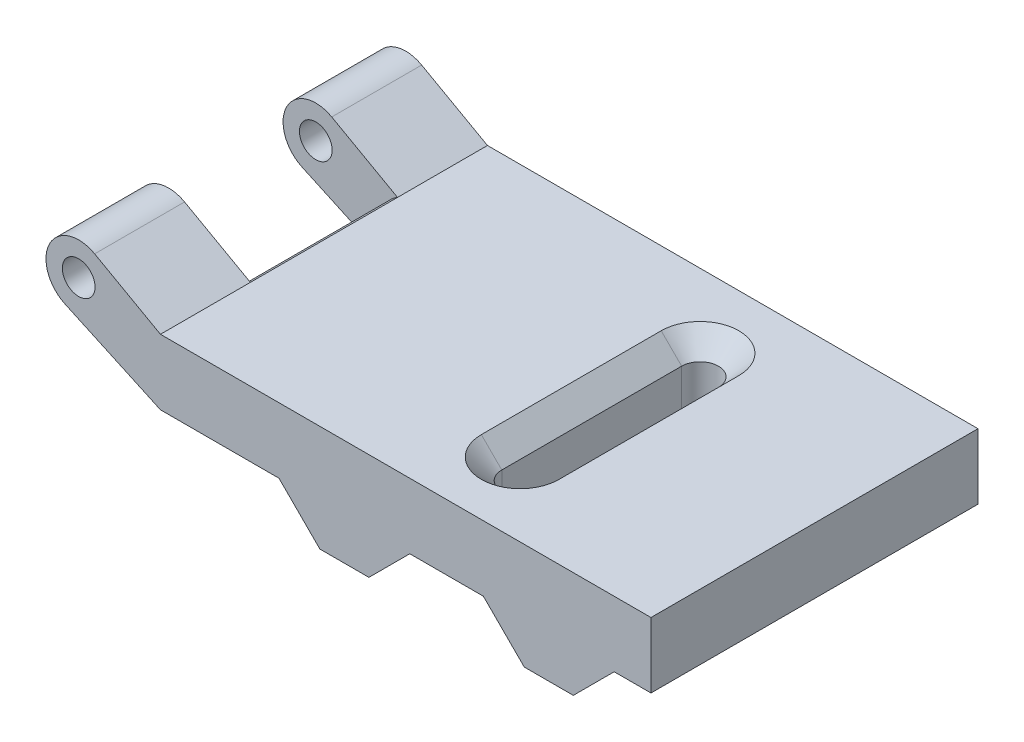
ISO-10303-21;
HEADER;
FILE_DESCRIPTION(('STEP AP214'),'2;1');
FILE_NAME('part.step','',(''),(''),'','','');
FILE_SCHEMA(('AUTOMOTIVE_DESIGN { 1 0 10303 214 1 1 1 1 }'));
ENDSEC;
DATA;
#1=APPLICATION_CONTEXT('core data for automotive mechanical design processes');
#2=APPLICATION_PROTOCOL_DEFINITION('international standard','automotive_design',2000,#1);
#3=PRODUCT_CONTEXT('',#1,'mechanical');
#4=PRODUCT('Part','Part','',(#3));
#5=PRODUCT_RELATED_PRODUCT_CATEGORY('part','',(#4));
#6=PRODUCT_DEFINITION_FORMATION('','',#4);
#7=PRODUCT_DEFINITION_CONTEXT('part definition',#1,'design');
#8=PRODUCT_DEFINITION('design','',#6,#7);
#9=PRODUCT_DEFINITION_SHAPE('','',#8);
#10=(LENGTH_UNIT() NAMED_UNIT(*) SI_UNIT(.MILLI.,.METRE.));
#11=(NAMED_UNIT(*) PLANE_ANGLE_UNIT() SI_UNIT($,.RADIAN.));
#12=(NAMED_UNIT(*) SI_UNIT($,.STERADIAN.) SOLID_ANGLE_UNIT());
#13=UNCERTAINTY_MEASURE_WITH_UNIT(LENGTH_MEASURE(1.E-05),#10,'distance_accuracy_value','');
#14=(GEOMETRIC_REPRESENTATION_CONTEXT(3) GLOBAL_UNCERTAINTY_ASSIGNED_CONTEXT((#13)) GLOBAL_UNIT_ASSIGNED_CONTEXT((#10,
#11,#12)) REPRESENTATION_CONTEXT('',''));
#15=CARTESIAN_POINT('',(0.,0.,0.));
#16=DIRECTION('',(0.,0.,1.));
#17=DIRECTION('',(1.,0.,0.));
#18=AXIS2_PLACEMENT_3D('',#15,#16,#17);
#19=CARTESIAN_POINT('',(-1.67087498802179,-3.63430554224644,40.));
#20=DIRECTION('',(0.417718747005448,0.908576385561609,0.));
#21=DIRECTION('',(-0.908576385561609,0.417718747005448,0.));
#22=AXIS2_PLACEMENT_3D('',#19,#20,#21);
#23=PLANE('',#22);
#24=DIRECTION('',(0.,0.,-1.));
#25=VECTOR('',#24,1.);
#26=CARTESIAN_POINT('',(10.,-9.,40.));
#27=LINE('',#26,#25);
#28=CARTESIAN_POINT('',(10.,-9.,11.));
#29=VERTEX_POINT('',#28);
#30=CARTESIAN_POINT('',(10.,-9.,0.));
#31=VERTEX_POINT('',#30);
#32=EDGE_CURVE('E305',#29,#31,#27,.T.);
#33=ORIENTED_EDGE('',*,*,#32,.F.);
#34=DIRECTION('',(-0.908576385561609,0.417718747005448,0.));
#35=VECTOR('',#34,1.);
#36=CARTESIAN_POINT('',(-1.67087498802178,-3.63430554224644,11.));
#37=LINE('',#36,#35);
#38=CARTESIAN_POINT('',(-1.67087498802179,-3.63430554224644,11.));
#39=VERTEX_POINT('',#38);
#40=EDGE_CURVE('E230',#29,#39,#37,.T.);
#41=ORIENTED_EDGE('',*,*,#40,.T.);
#42=DIRECTION('',(0.,0.,-1.));
#43=VECTOR('',#42,1.);
#44=CARTESIAN_POINT('',(-1.67087498802179,-3.63430554224644,40.));
#45=LINE('',#44,#43);
#46=CARTESIAN_POINT('',(-1.67087498802179,-3.63430554224644,0.));
#47=VERTEX_POINT('',#46);
#48=EDGE_CURVE('E227',#39,#47,#45,.T.);
#49=ORIENTED_EDGE('',*,*,#48,.T.);
#50=DIRECTION('',(0.908576385561609,-0.417718747005448,0.));
#51=VECTOR('',#50,1.);
#52=CARTESIAN_POINT('',(-1.67087498802179,-3.63430554224644,0.));
#53=LINE('',#52,#51);
#54=EDGE_CURVE('E501',#47,#31,#53,.T.);
#55=ORIENTED_EDGE('',*,*,#54,.T.);
#56=EDGE_LOOP('',(#33,#41,#49,#55));
#57=FACE_BOUND('',#56,.T.);
#58=ADVANCED_FACE('F41',(#57),#23,.F.);
#59=CARTESIAN_POINT('',(10.,-0.999999999999999,40.));
#60=DIRECTION('',(-0.487322222349435,-0.873222223494345,0.));
#61=DIRECTION('',(0.873222223494345,-0.487322222349435,0.));
#62=AXIS2_PLACEMENT_3D('',#59,#60,#61);
#63=PLANE('',#62);
#64=DIRECTION('',(0.,0.,-1.));
#65=VECTOR('',#64,1.);
#66=CARTESIAN_POINT('',(10.,-0.999999999999999,40.));
#67=LINE('',#66,#65);
#68=CARTESIAN_POINT('',(10.,-0.999999999999999,40.));
#69=VERTEX_POINT('',#68);
#70=CARTESIAN_POINT('',(10.,-0.999999999999999,29.));
#71=VERTEX_POINT('',#70);
#72=EDGE_CURVE('E260',#69,#71,#67,.T.);
#73=ORIENTED_EDGE('',*,*,#72,.T.);
#74=DIRECTION('',(-0.873222223494345,0.487322222349435,0.));
#75=VECTOR('',#74,1.);
#76=CARTESIAN_POINT('',(10.,-0.999999999999998,29.));
#77=LINE('',#76,#75);
#78=CARTESIAN_POINT('',(1.94928888939774,3.49288889397738,29.));
#79=VERTEX_POINT('',#78);
#80=EDGE_CURVE('E363',#71,#79,#77,.T.);
#81=ORIENTED_EDGE('',*,*,#80,.T.);
#82=DIRECTION('',(0.,0.,-1.));
#83=VECTOR('',#82,1.);
#84=CARTESIAN_POINT('',(1.94928888939774,3.49288889397738,40.));
#85=LINE('',#84,#83);
#86=CARTESIAN_POINT('',(1.94928888939774,3.49288889397738,40.));
#87=VERTEX_POINT('',#86);
#88=EDGE_CURVE('E248',#87,#79,#85,.T.);
#89=ORIENTED_EDGE('',*,*,#88,.F.);
#90=DIRECTION('',(-0.873222223494345,0.487322222349435,0.));
#91=VECTOR('',#90,1.);
#92=CARTESIAN_POINT('',(10.,-0.999999999999999,40.));
#93=LINE('',#92,#91);
#94=EDGE_CURVE('E249',#69,#87,#93,.T.);
#95=ORIENTED_EDGE('',*,*,#94,.F.);
#96=EDGE_LOOP('',(#73,#81,#89,#95));
#97=FACE_BOUND('',#96,.T.);
#98=ADVANCED_FACE('F563',(#97),#63,.F.);
#99=CARTESIAN_POINT('',(0.,0.,40.));
#100=DIRECTION('',(0.,0.,-1.));
#101=DIRECTION('',(-1.,0.,0.));
#102=AXIS2_PLACEMENT_3D('',#99,#100,#101);
#103=CYLINDRICAL_SURFACE('',#102,4.);
#104=ORIENTED_EDGE('',*,*,#88,.T.);
#105=CARTESIAN_POINT('',(0.,0.,29.));
#106=DIRECTION('',(0.,0.,1.));
#107=DIRECTION('',(1.,0.,0.));
#108=AXIS2_PLACEMENT_3D('',#105,#106,#107);
#109=CIRCLE('',#108,4.);
#110=CARTESIAN_POINT('',(-1.67087498802179,-3.63430554224644,29.));
#111=VERTEX_POINT('',#110);
#112=EDGE_CURVE('E422',#79,#111,#109,.T.);
#113=ORIENTED_EDGE('',*,*,#112,.T.);
#114=CARTESIAN_POINT('',(-1.67087498802179,-3.63430554224644,40.));
#115=VERTEX_POINT('',#114);
#116=EDGE_CURVE('E310',#115,#111,#45,.T.);
#117=ORIENTED_EDGE('',*,*,#116,.F.);
#118=CARTESIAN_POINT('',(0.,0.,40.));
#119=DIRECTION('',(0.,0.,1.));
#120=DIRECTION('',(1.,0.,0.));
#121=AXIS2_PLACEMENT_3D('',#118,#119,#120);
#122=CIRCLE('',#121,4.);
#123=EDGE_CURVE('E410',#87,#115,#122,.T.);
#124=ORIENTED_EDGE('',*,*,#123,.F.);
#125=EDGE_LOOP('',(#104,#113,#117,#124));
#126=FACE_BOUND('',#125,.T.);
#127=ADVANCED_FACE('F421',(#126),#103,.T.);
#128=CARTESIAN_POINT('',(0.,0.,40.));
#129=DIRECTION('',(0.,0.,-1.));
#130=DIRECTION('',(-1.,0.,0.));
#131=AXIS2_PLACEMENT_3D('',#128,#129,#130);
#132=CYLINDRICAL_SURFACE('',#131,2.);
#133=CARTESIAN_POINT('',(0.,0.,29.));
#134=DIRECTION('',(0.,0.,1.));
#135=DIRECTION('',(1.,0.,0.));
#136=AXIS2_PLACEMENT_3D('',#133,#134,#135);
#137=CIRCLE('',#136,2.);
#138=CARTESIAN_POINT('',(2.,0.,29.));
#139=VERTEX_POINT('',#138);
#140=EDGE_CURVE('E359',#139,#139,#137,.T.);
#141=ORIENTED_EDGE('',*,*,#140,.F.);
#142=EDGE_LOOP('',(#141));
#143=FACE_BOUND('',#142,.T.);
#144=CARTESIAN_POINT('',(0.,0.,40.));
#145=DIRECTION('',(0.,0.,1.));
#146=DIRECTION('',(1.,0.,0.));
#147=AXIS2_PLACEMENT_3D('',#144,#145,#146);
#148=CIRCLE('',#147,2.);
#149=CARTESIAN_POINT('',(2.,0.,40.));
#150=VERTEX_POINT('',#149);
#151=EDGE_CURVE('E460',#150,#150,#148,.T.);
#152=ORIENTED_EDGE('',*,*,#151,.T.);
#153=EDGE_LOOP('',(#152));
#154=FACE_BOUND('',#153,.T.);
#155=ADVANCED_FACE('F573',(#143,#154),#132,.F.);
#156=CARTESIAN_POINT('',(0.,0.,40.));
#157=DIRECTION('',(0.,0.,1.));
#158=DIRECTION('',(1.,0.,0.));
#159=AXIS2_PLACEMENT_3D('',#156,#157,#158);
#160=PLANE('',#159);
#161=ORIENTED_EDGE('',*,*,#123,.T.);
#162=DIRECTION('',(0.908576385561609,-0.417718747005448,0.));
#163=VECTOR('',#162,1.);
#164=CARTESIAN_POINT('',(-1.67087498802179,-3.63430554224644,40.));
#165=LINE('',#164,#163);
#166=CARTESIAN_POINT('',(10.,-9.,40.));
#167=VERTEX_POINT('',#166);
#168=EDGE_CURVE('E405',#115,#167,#165,.T.);
#169=ORIENTED_EDGE('',*,*,#168,.T.);
#170=DIRECTION('',(1.,0.,0.));
#171=VECTOR('',#170,1.);
#172=CARTESIAN_POINT('',(10.,-9.,40.));
#173=LINE('',#172,#171);
#174=CARTESIAN_POINT('',(24.5,-9.,40.));
#175=VERTEX_POINT('',#174);
#176=EDGE_CURVE('E403',#167,#175,#173,.T.);
#177=ORIENTED_EDGE('',*,*,#176,.T.);
#178=DIRECTION('',(0.707106781186546,-0.707106781186548,0.));
#179=VECTOR('',#178,1.);
#180=CARTESIAN_POINT('',(24.5,-9.,40.));
#181=LINE('',#180,#179);
#182=CARTESIAN_POINT('',(29.5,-14.,40.));
#183=VERTEX_POINT('',#182);
#184=EDGE_CURVE('E470',#175,#183,#181,.T.);
#185=ORIENTED_EDGE('',*,*,#184,.T.);
#186=DIRECTION('',(1.,0.,0.));
#187=VECTOR('',#186,1.);
#188=CARTESIAN_POINT('',(29.5,-14.,40.));
#189=LINE('',#188,#187);
#190=CARTESIAN_POINT('',(35.5,-14.,40.));
#191=VERTEX_POINT('',#190);
#192=EDGE_CURVE('E473',#183,#191,#189,.T.);
#193=ORIENTED_EDGE('',*,*,#192,.T.);
#194=DIRECTION('',(0.707106781186548,0.707106781186547,0.));
#195=VECTOR('',#194,1.);
#196=CARTESIAN_POINT('',(35.5,-14.,40.));
#197=LINE('',#196,#195);
#198=CARTESIAN_POINT('',(40.5,-9.,40.));
#199=VERTEX_POINT('',#198);
#200=EDGE_CURVE('E476',#191,#199,#197,.T.);
#201=ORIENTED_EDGE('',*,*,#200,.T.);
#202=DIRECTION('',(1.,0.,0.));
#203=VECTOR('',#202,1.);
#204=CARTESIAN_POINT('',(40.5,-9.,40.));
#205=LINE('',#204,#203);
#206=CARTESIAN_POINT('',(49.5,-9.,40.));
#207=VERTEX_POINT('',#206);
#208=EDGE_CURVE('E479',#199,#207,#205,.T.);
#209=ORIENTED_EDGE('',*,*,#208,.T.);
#210=DIRECTION('',(0.707106781186547,-0.707106781186548,0.));
#211=VECTOR('',#210,1.);
#212=CARTESIAN_POINT('',(49.5,-9.,40.));
#213=LINE('',#212,#211);
#214=CARTESIAN_POINT('',(54.5,-14.,40.));
#215=VERTEX_POINT('',#214);
#216=EDGE_CURVE('E482',#207,#215,#213,.T.);
#217=ORIENTED_EDGE('',*,*,#216,.T.);
#218=DIRECTION('',(1.,0.,0.));
#219=VECTOR('',#218,1.);
#220=CARTESIAN_POINT('',(54.5,-14.,40.));
#221=LINE('',#220,#219);
#222=CARTESIAN_POINT('',(60.5,-14.,40.));
#223=VERTEX_POINT('',#222);
#224=EDGE_CURVE('E485',#215,#223,#221,.T.);
#225=ORIENTED_EDGE('',*,*,#224,.T.);
#226=DIRECTION('',(0.707106781186548,0.707106781186547,0.));
#227=VECTOR('',#226,1.);
#228=CARTESIAN_POINT('',(60.5,-14.,40.));
#229=LINE('',#228,#227);
#230=CARTESIAN_POINT('',(65.5,-9.,40.));
#231=VERTEX_POINT('',#230);
#232=EDGE_CURVE('E488',#223,#231,#229,.T.);
#233=ORIENTED_EDGE('',*,*,#232,.T.);
#234=DIRECTION('',(1.,0.,0.));
#235=VECTOR('',#234,1.);
#236=CARTESIAN_POINT('',(65.5,-9.,40.));
#237=LINE('',#236,#235);
#238=CARTESIAN_POINT('',(70.,-9.,40.));
#239=VERTEX_POINT('',#238);
#240=EDGE_CURVE('E491',#231,#239,#237,.T.);
#241=ORIENTED_EDGE('',*,*,#240,.T.);
#242=DIRECTION('',(0.,1.,0.));
#243=VECTOR('',#242,1.);
#244=CARTESIAN_POINT('',(70.,-9.,40.));
#245=LINE('',#244,#243);
#246=CARTESIAN_POINT('',(70.,-0.999999999999999,40.));
#247=VERTEX_POINT('',#246);
#248=EDGE_CURVE('E494',#239,#247,#245,.T.);
#249=ORIENTED_EDGE('',*,*,#248,.T.);
#250=DIRECTION('',(-1.,0.,0.));
#251=VECTOR('',#250,1.);
#252=CARTESIAN_POINT('',(70.,-0.999999999999999,40.));
#253=LINE('',#252,#251);
#254=EDGE_CURVE('E255',#247,#69,#253,.T.);
#255=ORIENTED_EDGE('',*,*,#254,.T.);
#256=ORIENTED_EDGE('',*,*,#94,.T.);
#257=EDGE_LOOP('',(#161,#169,#177,#185,#193,#201,#209,#217,#225,#233,#241,#249,#255,#256));
#258=FACE_BOUND('',#257,.T.);
#259=ORIENTED_EDGE('',*,*,#151,.F.);
#260=EDGE_LOOP('',(#259));
#261=FACE_BOUND('',#260,.T.);
#262=ADVANCED_FACE('F413',(#258,#261),#160,.T.);
#263=CARTESIAN_POINT('',(0.,0.,0.));
#264=DIRECTION('',(0.,0.,1.));
#265=DIRECTION('',(1.,0.,0.));
#266=AXIS2_PLACEMENT_3D('',#263,#264,#265);
#267=PLANE('',#266);
#268=CARTESIAN_POINT('',(0.,0.,0.));
#269=DIRECTION('',(0.,0.,1.));
#270=DIRECTION('',(1.,0.,0.));
#271=AXIS2_PLACEMENT_3D('',#268,#269,#270);
#272=CIRCLE('',#271,4.);
#273=CARTESIAN_POINT('',(1.94928888939774,3.49288889397738,0.));
#274=VERTEX_POINT('',#273);
#275=EDGE_CURVE('E464',#274,#47,#272,.T.);
#276=ORIENTED_EDGE('',*,*,#275,.F.);
#277=DIRECTION('',(-0.873222223494345,0.487322222349435,0.));
#278=VECTOR('',#277,1.);
#279=CARTESIAN_POINT('',(10.,-0.999999999999999,0.));
#280=LINE('',#279,#278);
#281=CARTESIAN_POINT('',(10.,-0.999999999999999,0.));
#282=VERTEX_POINT('',#281);
#283=EDGE_CURVE('E245',#282,#274,#280,.T.);
#284=ORIENTED_EDGE('',*,*,#283,.F.);
#285=DIRECTION('',(-1.,0.,0.));
#286=VECTOR('',#285,1.);
#287=CARTESIAN_POINT('',(70.,-0.999999999999999,0.));
#288=LINE('',#287,#286);
#289=CARTESIAN_POINT('',(70.,-0.999999999999999,0.));
#290=VERTEX_POINT('',#289);
#291=EDGE_CURVE('E534',#290,#282,#288,.T.);
#292=ORIENTED_EDGE('',*,*,#291,.F.);
#293=DIRECTION('',(0.,1.,0.));
#294=VECTOR('',#293,1.);
#295=CARTESIAN_POINT('',(70.,-9.,0.));
#296=LINE('',#295,#294);
#297=CARTESIAN_POINT('',(70.,-9.,0.));
#298=VERTEX_POINT('',#297);
#299=EDGE_CURVE('E532',#298,#290,#296,.T.);
#300=ORIENTED_EDGE('',*,*,#299,.F.);
#301=DIRECTION('',(1.,0.,0.));
#302=VECTOR('',#301,1.);
#303=CARTESIAN_POINT('',(65.5,-9.,0.));
#304=LINE('',#303,#302);
#305=CARTESIAN_POINT('',(65.5,-9.,0.));
#306=VERTEX_POINT('',#305);
#307=EDGE_CURVE('E529',#306,#298,#304,.T.);
#308=ORIENTED_EDGE('',*,*,#307,.F.);
#309=DIRECTION('',(0.707106781186548,0.707106781186547,0.));
#310=VECTOR('',#309,1.);
#311=CARTESIAN_POINT('',(60.5,-14.,0.));
#312=LINE('',#311,#310);
#313=CARTESIAN_POINT('',(60.5,-14.,0.));
#314=VERTEX_POINT('',#313);
#315=EDGE_CURVE('E526',#314,#306,#312,.T.);
#316=ORIENTED_EDGE('',*,*,#315,.F.);
#317=DIRECTION('',(1.,0.,0.));
#318=VECTOR('',#317,1.);
#319=CARTESIAN_POINT('',(54.5,-14.,0.));
#320=LINE('',#319,#318);
#321=CARTESIAN_POINT('',(54.5,-14.,0.));
#322=VERTEX_POINT('',#321);
#323=EDGE_CURVE('E523',#322,#314,#320,.T.);
#324=ORIENTED_EDGE('',*,*,#323,.F.);
#325=DIRECTION('',(0.707106781186547,-0.707106781186548,0.));
#326=VECTOR('',#325,1.);
#327=CARTESIAN_POINT('',(49.5,-9.,0.));
#328=LINE('',#327,#326);
#329=CARTESIAN_POINT('',(49.5,-9.,0.));
#330=VERTEX_POINT('',#329);
#331=EDGE_CURVE('E520',#330,#322,#328,.T.);
#332=ORIENTED_EDGE('',*,*,#331,.F.);
#333=DIRECTION('',(1.,0.,0.));
#334=VECTOR('',#333,1.);
#335=CARTESIAN_POINT('',(40.5,-9.,0.));
#336=LINE('',#335,#334);
#337=CARTESIAN_POINT('',(40.5,-9.,0.));
#338=VERTEX_POINT('',#337);
#339=EDGE_CURVE('E517',#338,#330,#336,.T.);
#340=ORIENTED_EDGE('',*,*,#339,.F.);
#341=DIRECTION('',(0.707106781186548,0.707106781186547,0.));
#342=VECTOR('',#341,1.);
#343=CARTESIAN_POINT('',(35.5,-14.,0.));
#344=LINE('',#343,#342);
#345=CARTESIAN_POINT('',(35.5,-14.,0.));
#346=VERTEX_POINT('',#345);
#347=EDGE_CURVE('E514',#346,#338,#344,.T.);
#348=ORIENTED_EDGE('',*,*,#347,.F.);
#349=DIRECTION('',(1.,0.,0.));
#350=VECTOR('',#349,1.);
#351=CARTESIAN_POINT('',(29.5,-14.,0.));
#352=LINE('',#351,#350);
#353=CARTESIAN_POINT('',(29.5,-14.,0.));
#354=VERTEX_POINT('',#353);
#355=EDGE_CURVE('E511',#354,#346,#352,.T.);
#356=ORIENTED_EDGE('',*,*,#355,.F.);
#357=DIRECTION('',(0.707106781186546,-0.707106781186548,0.));
#358=VECTOR('',#357,1.);
#359=CARTESIAN_POINT('',(24.5,-9.,0.));
#360=LINE('',#359,#358);
#361=CARTESIAN_POINT('',(24.5,-9.,0.));
#362=VERTEX_POINT('',#361);
#363=EDGE_CURVE('E508',#362,#354,#360,.T.);
#364=ORIENTED_EDGE('',*,*,#363,.F.);
#365=DIRECTION('',(1.,0.,0.));
#366=VECTOR('',#365,1.);
#367=CARTESIAN_POINT('',(10.,-9.,0.));
#368=LINE('',#367,#366);
#369=EDGE_CURVE('E505',#31,#362,#368,.T.);
#370=ORIENTED_EDGE('',*,*,#369,.F.);
#371=ORIENTED_EDGE('',*,*,#54,.F.);
#372=EDGE_LOOP('',(#276,#284,#292,#300,#308,#316,#324,#332,#340,#348,#356,#364,#370,#371));
#373=FACE_BOUND('',#372,.T.);
#374=CARTESIAN_POINT('',(0.,0.,0.));
#375=DIRECTION('',(0.,0.,1.));
#376=DIRECTION('',(1.,0.,0.));
#377=AXIS2_PLACEMENT_3D('',#374,#375,#376);
#378=CIRCLE('',#377,2.);
#379=CARTESIAN_POINT('',(2.,0.,0.));
#380=VERTEX_POINT('',#379);
#381=EDGE_CURVE('E451',#380,#380,#378,.T.);
#382=ORIENTED_EDGE('',*,*,#381,.T.);
#383=EDGE_LOOP('',(#382));
#384=FACE_BOUND('',#383,.T.);
#385=ADVANCED_FACE('F547',(#373,#384),#267,.F.);
#386=CARTESIAN_POINT('',(0.,0.,11.));
#387=DIRECTION('',(0.,0.,-1.));
#388=DIRECTION('',(-1.,0.,0.));
#389=AXIS2_PLACEMENT_3D('',#386,#387,#388);
#390=CIRCLE('',#389,4.);
#391=CARTESIAN_POINT('',(1.94928888939774,3.49288889397738,11.));
#392=VERTEX_POINT('',#391);
#393=EDGE_CURVE('E220',#39,#392,#390,.T.);
#394=ORIENTED_EDGE('',*,*,#393,.T.);
#395=EDGE_CURVE('E225',#392,#274,#85,.T.);
#396=ORIENTED_EDGE('',*,*,#395,.T.);
#397=ORIENTED_EDGE('',*,*,#275,.T.);
#398=ORIENTED_EDGE('',*,*,#48,.F.);
#399=EDGE_LOOP('',(#394,#396,#397,#398));
#400=FACE_BOUND('',#399,.T.);
#401=ADVANCED_FACE('F222',(#400),#103,.T.);
#402=DIRECTION('',(0.908576385561609,-0.417718747005448,0.));
#403=VECTOR('',#402,1.);
#404=CARTESIAN_POINT('',(-1.6708749880218,-3.63430554224644,29.));
#405=LINE('',#404,#403);
#406=CARTESIAN_POINT('',(10.,-9.,29.));
#407=VERTEX_POINT('',#406);
#408=EDGE_CURVE('E57',#111,#407,#405,.T.);
#409=ORIENTED_EDGE('',*,*,#408,.T.);
#410=EDGE_CURVE('E306',#167,#407,#27,.T.);
#411=ORIENTED_EDGE('',*,*,#410,.F.);
#412=ORIENTED_EDGE('',*,*,#168,.F.);
#413=ORIENTED_EDGE('',*,*,#116,.T.);
#414=EDGE_LOOP('',(#409,#411,#412,#413));
#415=FACE_BOUND('',#414,.T.);
#416=ADVANCED_FACE('F404',(#415),#23,.F.);
#417=CARTESIAN_POINT('',(10.,-9.,40.));
#418=DIRECTION('',(0.,1.,0.));
#419=DIRECTION('',(0.,0.,1.));
#420=AXIS2_PLACEMENT_3D('',#417,#418,#419);
#421=PLANE('',#420);
#422=DIRECTION('',(0.,0.,-1.));
#423=VECTOR('',#422,1.);
#424=CARTESIAN_POINT('',(10.0330784594273,-9.00000000000001,20.));
#425=LINE('',#424,#423);
#426=CARTESIAN_POINT('',(10.0330784594273,-9.,29.));
#427=VERTEX_POINT('',#426);
#428=CARTESIAN_POINT('',(10.0330784594273,-9.00000000000001,11.));
#429=VERTEX_POINT('',#428);
#430=EDGE_CURVE('E374',#427,#429,#425,.T.);
#431=ORIENTED_EDGE('',*,*,#430,.T.);
#432=DIRECTION('',(-1.,0.,0.));
#433=VECTOR('',#432,1.);
#434=CARTESIAN_POINT('',(10.,-9.,11.));
#435=LINE('',#434,#433);
#436=EDGE_CURVE('E65',#429,#29,#435,.T.);
#437=ORIENTED_EDGE('',*,*,#436,.T.);
#438=ORIENTED_EDGE('',*,*,#32,.T.);
#439=ORIENTED_EDGE('',*,*,#369,.T.);
#440=DIRECTION('',(0.,0.,-1.));
#441=VECTOR('',#440,1.);
#442=CARTESIAN_POINT('',(24.5,-9.,40.));
#443=LINE('',#442,#441);
#444=EDGE_CURVE('E301',#175,#362,#443,.T.);
#445=ORIENTED_EDGE('',*,*,#444,.F.);
#446=ORIENTED_EDGE('',*,*,#176,.F.);
#447=ORIENTED_EDGE('',*,*,#410,.T.);
#448=DIRECTION('',(1.,0.,0.));
#449=VECTOR('',#448,1.);
#450=CARTESIAN_POINT('',(10.,-9.,29.));
#451=LINE('',#450,#449);
#452=EDGE_CURVE('E370',#407,#427,#451,.T.);
#453=ORIENTED_EDGE('',*,*,#452,.T.);
#454=EDGE_LOOP('',(#431,#437,#438,#439,#445,#446,#447,#453));
#455=FACE_BOUND('',#454,.T.);
#456=ADVANCED_FACE('F400',(#455),#421,.F.);
#457=CARTESIAN_POINT('',(24.5,-9.,40.));
#458=DIRECTION('',(0.707106781186548,0.707106781186547,0.));
#459=DIRECTION('',(-0.707106781186547,0.707106781186548,0.));
#460=AXIS2_PLACEMENT_3D('',#457,#458,#459);
#461=PLANE('',#460);
#462=ORIENTED_EDGE('',*,*,#363,.T.);
#463=DIRECTION('',(0.,0.,-1.));
#464=VECTOR('',#463,1.);
#465=CARTESIAN_POINT('',(29.5,-14.,40.));
#466=LINE('',#465,#464);
#467=EDGE_CURVE('E297',#183,#354,#466,.T.);
#468=ORIENTED_EDGE('',*,*,#467,.F.);
#469=ORIENTED_EDGE('',*,*,#184,.F.);
#470=ORIENTED_EDGE('',*,*,#444,.T.);
#471=EDGE_LOOP('',(#462,#468,#469,#470));
#472=FACE_BOUND('',#471,.T.);
#473=ADVANCED_FACE('F622',(#472),#461,.F.);
#474=CARTESIAN_POINT('',(29.5,-14.,40.));
#475=DIRECTION('',(0.,1.,0.));
#476=DIRECTION('',(0.,0.,1.));
#477=AXIS2_PLACEMENT_3D('',#474,#475,#476);
#478=PLANE('',#477);
#479=ORIENTED_EDGE('',*,*,#355,.T.);
#480=DIRECTION('',(0.,0.,-1.));
#481=VECTOR('',#480,1.);
#482=CARTESIAN_POINT('',(35.5,-14.,40.));
#483=LINE('',#482,#481);
#484=EDGE_CURVE('E293',#191,#346,#483,.T.);
#485=ORIENTED_EDGE('',*,*,#484,.F.);
#486=ORIENTED_EDGE('',*,*,#192,.F.);
#487=ORIENTED_EDGE('',*,*,#467,.T.);
#488=EDGE_LOOP('',(#479,#485,#486,#487));
#489=FACE_BOUND('',#488,.T.);
#490=ADVANCED_FACE('F618',(#489),#478,.F.);
#491=CARTESIAN_POINT('',(35.5,-14.,40.));
#492=DIRECTION('',(-0.707106781186547,0.707106781186548,0.));
#493=DIRECTION('',(-0.707106781186548,-0.707106781186547,0.));
#494=AXIS2_PLACEMENT_3D('',#491,#492,#493);
#495=PLANE('',#494);
#496=ORIENTED_EDGE('',*,*,#347,.T.);
#497=DIRECTION('',(0.,0.,-1.));
#498=VECTOR('',#497,1.);
#499=CARTESIAN_POINT('',(40.5,-9.,40.));
#500=LINE('',#499,#498);
#501=EDGE_CURVE('E289',#199,#338,#500,.T.);
#502=ORIENTED_EDGE('',*,*,#501,.F.);
#503=ORIENTED_EDGE('',*,*,#200,.F.);
#504=ORIENTED_EDGE('',*,*,#484,.T.);
#505=EDGE_LOOP('',(#496,#502,#503,#504));
#506=FACE_BOUND('',#505,.T.);
#507=ADVANCED_FACE('F614',(#506),#495,.F.);
#508=CARTESIAN_POINT('',(40.5,-9.,40.));
#509=DIRECTION('',(0.,1.,0.));
#510=DIRECTION('',(0.,0.,1.));
#511=AXIS2_PLACEMENT_3D('',#508,#509,#510);
#512=PLANE('',#511);
#513=DIRECTION('',(0.,0.,-1.));
#514=VECTOR('',#513,1.);
#515=CARTESIAN_POINT('',(42.75,-9.,31.));
#516=LINE('',#515,#514);
#517=CARTESIAN_POINT('',(42.75,-9.,31.));
#518=VERTEX_POINT('',#517);
#519=CARTESIAN_POINT('',(42.75,-9.,9.));
#520=VERTEX_POINT('',#519);
#521=EDGE_CURVE('E435',#518,#520,#516,.T.);
#522=ORIENTED_EDGE('',*,*,#521,.F.);
#523=CARTESIAN_POINT('',(45.,-9.,31.));
#524=DIRECTION('',(0.,-1.,0.));
#525=DIRECTION('',(0.,0.,-1.));
#526=AXIS2_PLACEMENT_3D('',#523,#524,#525);
#527=CIRCLE('',#526,2.25);
#528=CARTESIAN_POINT('',(47.25,-9.,31.));
#529=VERTEX_POINT('',#528);
#530=EDGE_CURVE('E354',#529,#518,#527,.T.);
#531=ORIENTED_EDGE('',*,*,#530,.F.);
#532=DIRECTION('',(0.,0.,1.));
#533=VECTOR('',#532,1.);
#534=CARTESIAN_POINT('',(47.25,-9.,31.));
#535=LINE('',#534,#533);
#536=CARTESIAN_POINT('',(47.25,-9.,9.));
#537=VERTEX_POINT('',#536);
#538=EDGE_CURVE('E443',#537,#529,#535,.T.);
#539=ORIENTED_EDGE('',*,*,#538,.F.);
#540=CARTESIAN_POINT('',(45.,-9.,9.));
#541=DIRECTION('',(0.,-1.,0.));
#542=DIRECTION('',(0.,0.,-1.));
#543=AXIS2_PLACEMENT_3D('',#540,#541,#542);
#544=CIRCLE('',#543,2.25);
#545=EDGE_CURVE('E439',#520,#537,#544,.T.);
#546=ORIENTED_EDGE('',*,*,#545,.F.);
#547=EDGE_LOOP('',(#522,#531,#539,#546));
#548=FACE_BOUND('',#547,.T.);
#549=ORIENTED_EDGE('',*,*,#339,.T.);
#550=DIRECTION('',(0.,0.,-1.));
#551=VECTOR('',#550,1.);
#552=CARTESIAN_POINT('',(49.5,-9.,40.));
#553=LINE('',#552,#551);
#554=EDGE_CURVE('E285',#207,#330,#553,.T.);
#555=ORIENTED_EDGE('',*,*,#554,.F.);
#556=ORIENTED_EDGE('',*,*,#208,.F.);
#557=ORIENTED_EDGE('',*,*,#501,.T.);
#558=EDGE_LOOP('',(#549,#555,#556,#557));
#559=FACE_BOUND('',#558,.T.);
#560=ADVANCED_FACE('F610',(#548,#559),#512,.F.);
#561=CARTESIAN_POINT('',(49.5,-9.,40.));
#562=DIRECTION('',(0.707106781186548,0.707106781186547,0.));
#563=DIRECTION('',(-0.707106781186547,0.707106781186548,0.));
#564=AXIS2_PLACEMENT_3D('',#561,#562,#563);
#565=PLANE('',#564);
#566=ORIENTED_EDGE('',*,*,#331,.T.);
#567=DIRECTION('',(0.,0.,-1.));
#568=VECTOR('',#567,1.);
#569=CARTESIAN_POINT('',(54.5,-14.,40.));
#570=LINE('',#569,#568);
#571=EDGE_CURVE('E281',#215,#322,#570,.T.);
#572=ORIENTED_EDGE('',*,*,#571,.F.);
#573=ORIENTED_EDGE('',*,*,#216,.F.);
#574=ORIENTED_EDGE('',*,*,#554,.T.);
#575=EDGE_LOOP('',(#566,#572,#573,#574));
#576=FACE_BOUND('',#575,.T.);
#577=ADVANCED_FACE('F606',(#576),#565,.F.);
#578=CARTESIAN_POINT('',(54.5,-14.,40.));
#579=DIRECTION('',(0.,1.,0.));
#580=DIRECTION('',(0.,0.,1.));
#581=AXIS2_PLACEMENT_3D('',#578,#579,#580);
#582=PLANE('',#581);
#583=ORIENTED_EDGE('',*,*,#323,.T.);
#584=DIRECTION('',(0.,0.,-1.));
#585=VECTOR('',#584,1.);
#586=CARTESIAN_POINT('',(60.5,-14.,40.));
#587=LINE('',#586,#585);
#588=EDGE_CURVE('E277',#223,#314,#587,.T.);
#589=ORIENTED_EDGE('',*,*,#588,.F.);
#590=ORIENTED_EDGE('',*,*,#224,.F.);
#591=ORIENTED_EDGE('',*,*,#571,.T.);
#592=EDGE_LOOP('',(#583,#589,#590,#591));
#593=FACE_BOUND('',#592,.T.);
#594=ADVANCED_FACE('F602',(#593),#582,.F.);
#595=CARTESIAN_POINT('',(60.5,-14.,40.));
#596=DIRECTION('',(-0.707106781186547,0.707106781186548,0.));
#597=DIRECTION('',(-0.707106781186548,-0.707106781186547,0.));
#598=AXIS2_PLACEMENT_3D('',#595,#596,#597);
#599=PLANE('',#598);
#600=ORIENTED_EDGE('',*,*,#315,.T.);
#601=DIRECTION('',(0.,0.,-1.));
#602=VECTOR('',#601,1.);
#603=CARTESIAN_POINT('',(65.5,-9.,40.));
#604=LINE('',#603,#602);
#605=EDGE_CURVE('E273',#231,#306,#604,.T.);
#606=ORIENTED_EDGE('',*,*,#605,.F.);
#607=ORIENTED_EDGE('',*,*,#232,.F.);
#608=ORIENTED_EDGE('',*,*,#588,.T.);
#609=EDGE_LOOP('',(#600,#606,#607,#608));
#610=FACE_BOUND('',#609,.T.);
#611=ADVANCED_FACE('F598',(#610),#599,.F.);
#612=CARTESIAN_POINT('',(65.5,-9.,40.));
#613=DIRECTION('',(0.,1.,0.));
#614=DIRECTION('',(-1.,0.,0.));
#615=AXIS2_PLACEMENT_3D('',#612,#613,#614);
#616=PLANE('',#615);
#617=ORIENTED_EDGE('',*,*,#307,.T.);
#618=DIRECTION('',(0.,0.,-1.));
#619=VECTOR('',#618,1.);
#620=CARTESIAN_POINT('',(70.,-9.,40.));
#621=LINE('',#620,#619);
#622=EDGE_CURVE('E269',#239,#298,#621,.T.);
#623=ORIENTED_EDGE('',*,*,#622,.F.);
#624=ORIENTED_EDGE('',*,*,#240,.F.);
#625=ORIENTED_EDGE('',*,*,#605,.T.);
#626=EDGE_LOOP('',(#617,#623,#624,#625));
#627=FACE_BOUND('',#626,.T.);
#628=ADVANCED_FACE('F592',(#627),#616,.F.);
#629=CARTESIAN_POINT('',(70.,-9.,40.));
#630=DIRECTION('',(-1.,0.,0.));
#631=DIRECTION('',(0.,0.,1.));
#632=AXIS2_PLACEMENT_3D('',#629,#630,#631);
#633=PLANE('',#632);
#634=ORIENTED_EDGE('',*,*,#299,.T.);
#635=DIRECTION('',(0.,0.,-1.));
#636=VECTOR('',#635,1.);
#637=CARTESIAN_POINT('',(70.,-0.999999999999999,40.));
#638=LINE('',#637,#636);
#639=EDGE_CURVE('E264',#247,#290,#638,.T.);
#640=ORIENTED_EDGE('',*,*,#639,.F.);
#641=ORIENTED_EDGE('',*,*,#248,.F.);
#642=ORIENTED_EDGE('',*,*,#622,.T.);
#643=EDGE_LOOP('',(#634,#640,#641,#642));
#644=FACE_BOUND('',#643,.T.);
#645=ADVANCED_FACE('F587',(#644),#633,.F.);
#646=CARTESIAN_POINT('',(70.,-0.999999999999999,40.));
#647=DIRECTION('',(0.,-1.,0.));
#648=DIRECTION('',(0.,0.,-1.));
#649=AXIS2_PLACEMENT_3D('',#646,#647,#648);
#650=PLANE('',#649);
#651=CARTESIAN_POINT('',(45.,-0.999999999999999,9.));
#652=DIRECTION('',(0.,-1.,0.));
#653=DIRECTION('',(0.,0.,-1.));
#654=AXIS2_PLACEMENT_3D('',#651,#652,#653);
#655=CIRCLE('',#654,4.75);
#656=CARTESIAN_POINT('',(40.25,-0.999999999999999,9.));
#657=VERTEX_POINT('',#656);
#658=CARTESIAN_POINT('',(49.75,-0.999999999999999,9.));
#659=VERTEX_POINT('',#658);
#660=EDGE_CURVE('E316',#657,#659,#655,.T.);
#661=ORIENTED_EDGE('',*,*,#660,.T.);
#662=DIRECTION('',(0.,0.,1.));
#663=VECTOR('',#662,1.);
#664=CARTESIAN_POINT('',(49.75,-0.999999999999999,40.));
#665=LINE('',#664,#663);
#666=CARTESIAN_POINT('',(49.75,-0.999999999999999,31.));
#667=VERTEX_POINT('',#666);
#668=EDGE_CURVE('E322',#659,#667,#665,.T.);
#669=ORIENTED_EDGE('',*,*,#668,.T.);
#670=CARTESIAN_POINT('',(45.,-0.999999999999999,31.));
#671=DIRECTION('',(0.,-1.,0.));
#672=DIRECTION('',(0.,0.,-1.));
#673=AXIS2_PLACEMENT_3D('',#670,#671,#672);
#674=CIRCLE('',#673,4.75);
#675=CARTESIAN_POINT('',(40.25,-0.999999999999999,31.));
#676=VERTEX_POINT('',#675);
#677=EDGE_CURVE('E319',#667,#676,#674,.T.);
#678=ORIENTED_EDGE('',*,*,#677,.T.);
#679=DIRECTION('',(0.,0.,-1.));
#680=VECTOR('',#679,1.);
#681=CARTESIAN_POINT('',(40.25,-0.999999999999999,40.));
#682=LINE('',#681,#680);
#683=EDGE_CURVE('E313',#676,#657,#682,.T.);
#684=ORIENTED_EDGE('',*,*,#683,.T.);
#685=EDGE_LOOP('',(#661,#669,#678,#684));
#686=FACE_BOUND('',#685,.T.);
#687=ORIENTED_EDGE('',*,*,#291,.T.);
#688=CARTESIAN_POINT('',(10.,-0.999999999999999,11.));
#689=VERTEX_POINT('',#688);
#690=EDGE_CURVE('E254',#689,#282,#67,.T.);
#691=ORIENTED_EDGE('',*,*,#690,.F.);
#692=EDGE_CURVE('E265',#71,#689,#67,.T.);
#693=ORIENTED_EDGE('',*,*,#692,.F.);
#694=ORIENTED_EDGE('',*,*,#72,.F.);
#695=ORIENTED_EDGE('',*,*,#254,.F.);
#696=ORIENTED_EDGE('',*,*,#639,.T.);
#697=EDGE_LOOP('',(#687,#691,#693,#694,#695,#696));
#698=FACE_BOUND('',#697,.T.);
#699=ADVANCED_FACE('F540',(#686,#698),#650,.F.);
#700=DIRECTION('',(0.873222223494345,-0.487322222349435,0.));
#701=VECTOR('',#700,1.);
#702=CARTESIAN_POINT('',(10.,-1.00000000000001,11.));
#703=LINE('',#702,#701);
#704=EDGE_CURVE('E231',#392,#689,#703,.T.);
#705=ORIENTED_EDGE('',*,*,#704,.T.);
#706=ORIENTED_EDGE('',*,*,#690,.T.);
#707=ORIENTED_EDGE('',*,*,#283,.T.);
#708=ORIENTED_EDGE('',*,*,#395,.F.);
#709=EDGE_LOOP('',(#705,#706,#707,#708));
#710=FACE_BOUND('',#709,.T.);
#711=ADVANCED_FACE('F243',(#710),#63,.F.);
#712=CARTESIAN_POINT('',(0.,0.,11.));
#713=DIRECTION('',(0.,0.,-1.));
#714=DIRECTION('',(-1.,0.,0.));
#715=AXIS2_PLACEMENT_3D('',#712,#713,#714);
#716=CIRCLE('',#715,2.);
#717=CARTESIAN_POINT('',(-2.,0.,11.));
#718=VERTEX_POINT('',#717);
#719=EDGE_CURVE('E241',#718,#718,#716,.T.);
#720=ORIENTED_EDGE('',*,*,#719,.F.);
#721=EDGE_LOOP('',(#720));
#722=FACE_BOUND('',#721,.T.);
#723=ORIENTED_EDGE('',*,*,#381,.F.);
#724=EDGE_LOOP('',(#723));
#725=FACE_BOUND('',#724,.T.);
#726=ADVANCED_FACE('F579',(#722,#725),#132,.F.);
#727=CARTESIAN_POINT('',(45.,4.,31.));
#728=DIRECTION('',(0.,-1.,0.));
#729=DIRECTION('',(0.,0.,-1.));
#730=AXIS2_PLACEMENT_3D('',#727,#728,#729);
#731=CYLINDRICAL_SURFACE('',#730,2.25);
#732=DIRECTION('',(0.,-1.,0.));
#733=VECTOR('',#732,1.);
#734=CARTESIAN_POINT('',(42.75,4.,31.));
#735=LINE('',#734,#733);
#736=CARTESIAN_POINT('',(42.75,-3.50000000000001,31.));
#737=VERTEX_POINT('',#736);
#738=EDGE_CURVE('E447',#737,#518,#735,.T.);
#739=ORIENTED_EDGE('',*,*,#738,.F.);
#740=CARTESIAN_POINT('',(45.,-3.50000000000001,31.));
#741=DIRECTION('',(0.,-1.,0.));
#742=DIRECTION('',(0.,0.,-1.));
#743=AXIS2_PLACEMENT_3D('',#740,#741,#742);
#744=CIRCLE('',#743,2.25);
#745=CARTESIAN_POINT('',(47.25,-3.50000000000001,31.));
#746=VERTEX_POINT('',#745);
#747=EDGE_CURVE('E330',#737,#746,#744,.F.);
#748=ORIENTED_EDGE('',*,*,#747,.T.);
#749=DIRECTION('',(0.,-1.,0.));
#750=VECTOR('',#749,1.);
#751=CARTESIAN_POINT('',(47.25,4.,31.));
#752=LINE('',#751,#750);
#753=EDGE_CURVE('E448',#746,#529,#752,.T.);
#754=ORIENTED_EDGE('',*,*,#753,.T.);
#755=ORIENTED_EDGE('',*,*,#530,.T.);
#756=EDGE_LOOP('',(#739,#748,#754,#755));
#757=FACE_BOUND('',#756,.T.);
#758=ADVANCED_FACE('F584',(#757),#731,.F.);
#759=CARTESIAN_POINT('',(47.25,4.,31.));
#760=DIRECTION('',(1.,0.,0.));
#761=DIRECTION('',(0.,0.,-1.));
#762=AXIS2_PLACEMENT_3D('',#759,#760,#761);
#763=PLANE('',#762);
#764=ORIENTED_EDGE('',*,*,#753,.F.);
#765=DIRECTION('',(0.,0.,-1.));
#766=VECTOR('',#765,1.);
#767=CARTESIAN_POINT('',(47.25,-3.50000000000001,31.));
#768=LINE('',#767,#766);
#769=CARTESIAN_POINT('',(47.25,-3.50000000000001,9.));
#770=VERTEX_POINT('',#769);
#771=EDGE_CURVE('E326',#746,#770,#768,.T.);
#772=ORIENTED_EDGE('',*,*,#771,.T.);
#773=DIRECTION('',(0.,-1.,0.));
#774=VECTOR('',#773,1.);
#775=CARTESIAN_POINT('',(47.25,4.,9.));
#776=LINE('',#775,#774);
#777=EDGE_CURVE('E452',#770,#537,#776,.T.);
#778=ORIENTED_EDGE('',*,*,#777,.T.);
#779=ORIENTED_EDGE('',*,*,#538,.T.);
#780=EDGE_LOOP('',(#764,#772,#778,#779));
#781=FACE_BOUND('',#780,.T.);
#782=ADVANCED_FACE('F673',(#781),#763,.F.);
#783=CARTESIAN_POINT('',(45.,4.,9.));
#784=DIRECTION('',(0.,-1.,0.));
#785=DIRECTION('',(0.,0.,-1.));
#786=AXIS2_PLACEMENT_3D('',#783,#784,#785);
#787=CYLINDRICAL_SURFACE('',#786,2.25);
#788=ORIENTED_EDGE('',*,*,#777,.F.);
#789=CARTESIAN_POINT('',(45.,-3.50000000000001,9.));
#790=DIRECTION('',(0.,-1.,0.));
#791=DIRECTION('',(0.,0.,-1.));
#792=AXIS2_PLACEMENT_3D('',#789,#790,#791);
#793=CIRCLE('',#792,2.25);
#794=CARTESIAN_POINT('',(42.75,-3.50000000000001,9.));
#795=VERTEX_POINT('',#794);
#796=EDGE_CURVE('E333',#770,#795,#793,.F.);
#797=ORIENTED_EDGE('',*,*,#796,.T.);
#798=DIRECTION('',(0.,-1.,0.));
#799=VECTOR('',#798,1.);
#800=CARTESIAN_POINT('',(42.75,4.,9.));
#801=LINE('',#800,#799);
#802=EDGE_CURVE('E455',#795,#520,#801,.T.);
#803=ORIENTED_EDGE('',*,*,#802,.T.);
#804=ORIENTED_EDGE('',*,*,#545,.T.);
#805=EDGE_LOOP('',(#788,#797,#803,#804));
#806=FACE_BOUND('',#805,.T.);
#807=ADVANCED_FACE('F676',(#806),#787,.F.);
#808=CARTESIAN_POINT('',(42.75,4.,31.));
#809=DIRECTION('',(-1.,0.,0.));
#810=DIRECTION('',(0.,0.,1.));
#811=AXIS2_PLACEMENT_3D('',#808,#809,#810);
#812=PLANE('',#811);
#813=ORIENTED_EDGE('',*,*,#802,.F.);
#814=DIRECTION('',(0.,0.,1.));
#815=VECTOR('',#814,1.);
#816=CARTESIAN_POINT('',(42.75,-3.50000000000001,31.));
#817=LINE('',#816,#815);
#818=EDGE_CURVE('E336',#795,#737,#817,.T.);
#819=ORIENTED_EDGE('',*,*,#818,.T.);
#820=ORIENTED_EDGE('',*,*,#738,.T.);
#821=ORIENTED_EDGE('',*,*,#521,.T.);
#822=EDGE_LOOP('',(#813,#819,#820,#821));
#823=FACE_BOUND('',#822,.T.);
#824=ADVANCED_FACE('F657',(#823),#812,.F.);
#825=CARTESIAN_POINT('',(40.25,-0.999999999999999,40.));
#826=DIRECTION('',(-0.707106781186549,-0.707106781186547,0.));
#827=DIRECTION('',(0.,0.,-1.));
#828=AXIS2_PLACEMENT_3D('',#825,#826,#827);
#829=PLANE('',#828);
#830=DIRECTION('',(-0.707106781186547,0.707106781186549,0.));
#831=VECTOR('',#830,1.);
#832=CARTESIAN_POINT('',(42.75,-3.50000000000001,31.));
#833=LINE('',#832,#831);
#834=EDGE_CURVE('E346',#737,#676,#833,.T.);
#835=ORIENTED_EDGE('',*,*,#834,.F.);
#836=ORIENTED_EDGE('',*,*,#818,.F.);
#837=DIRECTION('',(0.707106781186547,-0.707106781186549,0.));
#838=VECTOR('',#837,1.);
#839=CARTESIAN_POINT('',(40.25,-0.999999999999999,9.));
#840=LINE('',#839,#838);
#841=EDGE_CURVE('E350',#657,#795,#840,.T.);
#842=ORIENTED_EDGE('',*,*,#841,.F.);
#843=ORIENTED_EDGE('',*,*,#683,.F.);
#844=EDGE_LOOP('',(#835,#836,#842,#843));
#845=FACE_BOUND('',#844,.T.);
#846=ADVANCED_FACE('F652',(#845),#829,.F.);
#847=CARTESIAN_POINT('',(45.,-0.999999999999999,9.));
#848=DIRECTION('',(0.,1.,0.));
#849=DIRECTION('',(0.,0.,1.));
#850=AXIS2_PLACEMENT_3D('',#847,#848,#849);
#851=CONICAL_SURFACE('',#850,4.75,0.785398163397447);
#852=ORIENTED_EDGE('',*,*,#841,.T.);
#853=ORIENTED_EDGE('',*,*,#796,.F.);
#854=DIRECTION('',(-0.707106781186547,-0.707106781186549,0.));
#855=VECTOR('',#854,1.);
#856=CARTESIAN_POINT('',(49.75,-0.999999999999999,9.));
#857=LINE('',#856,#855);
#858=EDGE_CURVE('E343',#659,#770,#857,.T.);
#859=ORIENTED_EDGE('',*,*,#858,.F.);
#860=ORIENTED_EDGE('',*,*,#660,.F.);
#861=EDGE_LOOP('',(#852,#853,#859,#860));
#862=FACE_BOUND('',#861,.T.);
#863=ADVANCED_FACE('F645',(#862),#851,.F.);
#864=CARTESIAN_POINT('',(45.,-0.999999999999999,31.));
#865=DIRECTION('',(0.,1.,0.));
#866=DIRECTION('',(0.,0.,1.));
#867=AXIS2_PLACEMENT_3D('',#864,#865,#866);
#868=CONICAL_SURFACE('',#867,4.75,0.785398163397447);
#869=ORIENTED_EDGE('',*,*,#834,.T.);
#870=ORIENTED_EDGE('',*,*,#677,.F.);
#871=DIRECTION('',(0.707106781186547,0.707106781186549,0.));
#872=VECTOR('',#871,1.);
#873=CARTESIAN_POINT('',(47.25,-3.50000000000001,31.));
#874=LINE('',#873,#872);
#875=EDGE_CURVE('E340',#746,#667,#874,.T.);
#876=ORIENTED_EDGE('',*,*,#875,.F.);
#877=ORIENTED_EDGE('',*,*,#747,.F.);
#878=EDGE_LOOP('',(#869,#870,#876,#877));
#879=FACE_BOUND('',#878,.T.);
#880=ADVANCED_FACE('F638',(#879),#868,.F.);
#881=CARTESIAN_POINT('',(49.75,-0.999999999999999,40.));
#882=DIRECTION('',(0.707106781186549,-0.707106781186547,0.));
#883=DIRECTION('',(0.,0.,1.));
#884=AXIS2_PLACEMENT_3D('',#881,#882,#883);
#885=PLANE('',#884);
#886=ORIENTED_EDGE('',*,*,#858,.T.);
#887=ORIENTED_EDGE('',*,*,#771,.F.);
#888=ORIENTED_EDGE('',*,*,#875,.T.);
#889=ORIENTED_EDGE('',*,*,#668,.F.);
#890=EDGE_LOOP('',(#886,#887,#888,#889));
#891=FACE_BOUND('',#890,.T.);
#892=ADVANCED_FACE('F632',(#891),#885,.F.);
#893=CARTESIAN_POINT('',(7.99999999999999,4.,29.));
#894=DIRECTION('',(1.,0.,0.));
#895=DIRECTION('',(0.,0.,-1.));
#896=AXIS2_PLACEMENT_3D('',#893,#894,#895);
#897=PLANE('',#896);
#898=DIRECTION('',(0.,-1.,0.));
#899=VECTOR('',#898,1.);
#900=CARTESIAN_POINT('',(7.99999999999999,4.,29.));
#901=LINE('',#900,#899);
#902=CARTESIAN_POINT('',(7.99999999999999,-4.46410161513776,29.));
#903=VERTEX_POINT('',#902);
#904=CARTESIAN_POINT('',(7.99999999999999,-5.5170099550485,29.));
#905=VERTEX_POINT('',#904);
#906=EDGE_CURVE('E358',#903,#905,#901,.T.);
#907=ORIENTED_EDGE('',*,*,#906,.F.);
#908=DIRECTION('',(0.,0.,1.));
#909=VECTOR('',#908,1.);
#910=CARTESIAN_POINT('',(7.99999999999999,-4.46410161513776,29.));
#911=LINE('',#910,#909);
#912=CARTESIAN_POINT('',(8.,-4.46410161513776,11.));
#913=VERTEX_POINT('',#912);
#914=EDGE_CURVE('E367',#903,#913,#911,.F.);
#915=ORIENTED_EDGE('',*,*,#914,.T.);
#916=DIRECTION('',(0.,-1.,0.));
#917=VECTOR('',#916,1.);
#918=CARTESIAN_POINT('',(8.,4.,11.));
#919=LINE('',#918,#917);
#920=CARTESIAN_POINT('',(8.,-5.5170099550485,11.));
#921=VERTEX_POINT('',#920);
#922=EDGE_CURVE('E386',#913,#921,#919,.T.);
#923=ORIENTED_EDGE('',*,*,#922,.T.);
#924=DIRECTION('',(0.,0.,-1.));
#925=VECTOR('',#924,1.);
#926=CARTESIAN_POINT('',(7.99999999999999,-5.5170099550485,29.));
#927=LINE('',#926,#925);
#928=EDGE_CURVE('E339',#921,#905,#927,.F.);
#929=ORIENTED_EDGE('',*,*,#928,.T.);
#930=EDGE_LOOP('',(#907,#915,#923,#929));
#931=FACE_BOUND('',#930,.T.);
#932=ADVANCED_FACE('F392',(#931),#897,.F.);
#933=CARTESIAN_POINT('',(-4.00000000000001,4.,29.));
#934=DIRECTION('',(0.,0.,1.));
#935=DIRECTION('',(1.,0.,0.));
#936=AXIS2_PLACEMENT_3D('',#933,#934,#935);
#937=PLANE('',#936);
#938=ORIENTED_EDGE('',*,*,#140,.T.);
#939=EDGE_LOOP('',(#938));
#940=FACE_BOUND('',#939,.T.);
#941=ORIENTED_EDGE('',*,*,#112,.F.);
#942=ORIENTED_EDGE('',*,*,#80,.F.);
#943=CARTESIAN_POINT('',(12.,-4.46410161513776,29.));
#944=DIRECTION('',(0.,0.,1.));
#945=DIRECTION('',(1.,0.,0.));
#946=AXIS2_PLACEMENT_3D('',#943,#944,#945);
#947=CIRCLE('',#946,4.);
#948=EDGE_CURVE('E379',#71,#903,#947,.T.);
#949=ORIENTED_EDGE('',*,*,#948,.T.);
#950=ORIENTED_EDGE('',*,*,#906,.T.);
#951=CARTESIAN_POINT('',(12.,-5.5170099550485,29.));
#952=DIRECTION('',(0.,0.,1.));
#953=DIRECTION('',(1.,0.,0.));
#954=AXIS2_PLACEMENT_3D('',#951,#952,#953);
#955=CIRCLE('',#954,4.);
#956=EDGE_CURVE('E11',#905,#427,#955,.T.);
#957=ORIENTED_EDGE('',*,*,#956,.T.);
#958=ORIENTED_EDGE('',*,*,#452,.F.);
#959=ORIENTED_EDGE('',*,*,#408,.F.);
#960=EDGE_LOOP('',(#941,#942,#949,#950,#957,#958,#959));
#961=FACE_BOUND('',#960,.T.);
#962=ADVANCED_FACE('F398',(#940,#961),#937,.F.);
#963=CARTESIAN_POINT('',(-4.,4.,11.));
#964=DIRECTION('',(0.,0.,-1.));
#965=DIRECTION('',(-1.,0.,0.));
#966=AXIS2_PLACEMENT_3D('',#963,#964,#965);
#967=PLANE('',#966);
#968=ORIENTED_EDGE('',*,*,#719,.T.);
#969=EDGE_LOOP('',(#968));
#970=FACE_BOUND('',#969,.T.);
#971=ORIENTED_EDGE('',*,*,#922,.F.);
#972=CARTESIAN_POINT('',(12.,-4.46410161513776,11.));
#973=DIRECTION('',(0.,0.,-1.));
#974=DIRECTION('',(-1.,0.,0.));
#975=AXIS2_PLACEMENT_3D('',#972,#973,#974);
#976=CIRCLE('',#975,4.);
#977=EDGE_CURVE('E237',#913,#689,#976,.T.);
#978=ORIENTED_EDGE('',*,*,#977,.T.);
#979=ORIENTED_EDGE('',*,*,#704,.F.);
#980=ORIENTED_EDGE('',*,*,#393,.F.);
#981=ORIENTED_EDGE('',*,*,#40,.F.);
#982=ORIENTED_EDGE('',*,*,#436,.F.);
#983=CARTESIAN_POINT('',(12.,-5.5170099550485,11.));
#984=DIRECTION('',(0.,0.,-1.));
#985=DIRECTION('',(-1.,0.,0.));
#986=AXIS2_PLACEMENT_3D('',#983,#984,#985);
#987=CIRCLE('',#986,4.);
#988=EDGE_CURVE('E50',#429,#921,#987,.T.);
#989=ORIENTED_EDGE('',*,*,#988,.T.);
#990=EDGE_LOOP('',(#971,#978,#979,#980,#981,#982,#989));
#991=FACE_BOUND('',#990,.T.);
#992=ADVANCED_FACE('F235',(#970,#991),#967,.F.);
#993=CARTESIAN_POINT('',(12.,-4.46410161513776,40.));
#994=DIRECTION('',(0.,0.,1.));
#995=DIRECTION('',(1.,0.,0.));
#996=AXIS2_PLACEMENT_3D('',#993,#994,#995);
#997=CYLINDRICAL_SURFACE('',#996,4.);
#998=ORIENTED_EDGE('',*,*,#977,.F.);
#999=ORIENTED_EDGE('',*,*,#914,.F.);
#1000=ORIENTED_EDGE('',*,*,#948,.F.);
#1001=ORIENTED_EDGE('',*,*,#692,.T.);
#1002=EDGE_LOOP('',(#998,#999,#1000,#1001));
#1003=FACE_BOUND('',#1002,.T.);
#1004=ADVANCED_FACE('F560',(#1003),#997,.T.);
#1005=CARTESIAN_POINT('',(12.,-5.51700995504849,40.));
#1006=DIRECTION('',(0.,0.,-1.));
#1007=DIRECTION('',(-1.,0.,0.));
#1008=AXIS2_PLACEMENT_3D('',#1005,#1006,#1007);
#1009=CYLINDRICAL_SURFACE('',#1008,4.);
#1010=ORIENTED_EDGE('',*,*,#956,.F.);
#1011=ORIENTED_EDGE('',*,*,#928,.F.);
#1012=ORIENTED_EDGE('',*,*,#988,.F.);
#1013=ORIENTED_EDGE('',*,*,#430,.F.);
#1014=EDGE_LOOP('',(#1010,#1011,#1012,#1013));
#1015=FACE_BOUND('',#1014,.T.);
#1016=ADVANCED_FACE('F43',(#1015),#1009,.T.);
#1017=CLOSED_SHELL('',(#58,#98,#127,#155,#262,#385,#401,#416,#456,#473,#490,#507,#560,#577,#594,
#611,#628,#645,#699,#711,#726,#758,#782,#807,#824,#846,#863,#880,#892,#932,#962,#992,#1004,#1016));
#1018=MANIFOLD_SOLID_BREP('B2',#1017);
#1019=ADVANCED_BREP_SHAPE_REPRESENTATION('',(#18,#1018),#14);
#1020=SHAPE_DEFINITION_REPRESENTATION(#9,#1019);
ENDSEC;
END-ISO-10303-21;
